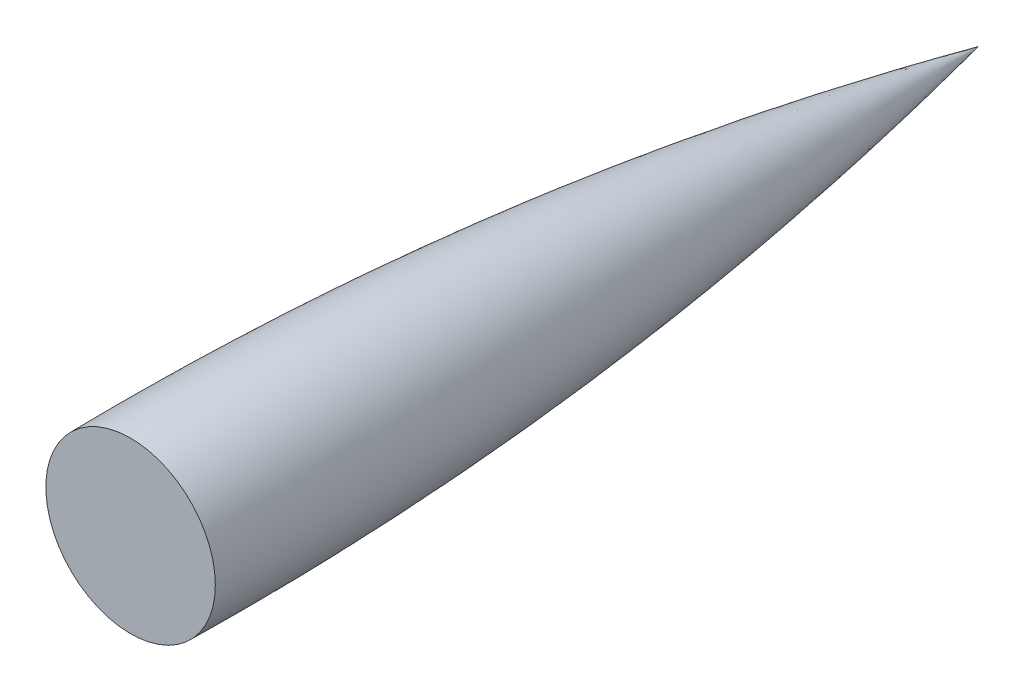
ISO-10303-21;
HEADER;
FILE_DESCRIPTION(('STEP AP214'),'2;1');
FILE_NAME('part.step','',(''),(''),'','','');
FILE_SCHEMA(('AUTOMOTIVE_DESIGN { 1 0 10303 214 1 1 1 1 }'));
ENDSEC;
DATA;
#1=APPLICATION_CONTEXT('core data for automotive mechanical design processes');
#2=APPLICATION_PROTOCOL_DEFINITION('international standard','automotive_design',2000,#1);
#3=PRODUCT_CONTEXT('',#1,'mechanical');
#4=PRODUCT('Part','Part','',(#3));
#5=PRODUCT_RELATED_PRODUCT_CATEGORY('part','',(#4));
#6=PRODUCT_DEFINITION_FORMATION('','',#4);
#7=PRODUCT_DEFINITION_CONTEXT('part definition',#1,'design');
#8=PRODUCT_DEFINITION('design','',#6,#7);
#9=PRODUCT_DEFINITION_SHAPE('','',#8);
#10=(LENGTH_UNIT() NAMED_UNIT(*) SI_UNIT(.MILLI.,.METRE.));
#11=(NAMED_UNIT(*) PLANE_ANGLE_UNIT() SI_UNIT($,.RADIAN.));
#12=(NAMED_UNIT(*) SI_UNIT($,.STERADIAN.) SOLID_ANGLE_UNIT());
#13=UNCERTAINTY_MEASURE_WITH_UNIT(LENGTH_MEASURE(1.E-05),#10,'distance_accuracy_value','');
#14=(GEOMETRIC_REPRESENTATION_CONTEXT(3) GLOBAL_UNCERTAINTY_ASSIGNED_CONTEXT((#13)) GLOBAL_UNIT_ASSIGNED_CONTEXT((#10,
#11,#12)) REPRESENTATION_CONTEXT('',''));
#15=CARTESIAN_POINT('',(0.,0.,0.));
#16=DIRECTION('',(0.,0.,1.));
#17=DIRECTION('',(1.,0.,0.));
#18=AXIS2_PLACEMENT_3D('',#15,#16,#17);
#19=CARTESIAN_POINT('',(-2220.90389982806,0.,-29.369610017194));
#20=DIRECTION('',(0.,-1.,0.));
#21=DIRECTION('',(1.,0.,0.));
#22=AXIS2_PLACEMENT_3D('',#19,#20,#21);
#23=CIRCLE('',#22,2271.89374366113);
#24=TRIMMED_CURVE('',#23,(PARAMETER_VALUE(-0.212265034629429)),
(PARAMETER_VALUE(0.212265034629429)),.T.,.PARAMETER.);
#25=CARTESIAN_POINT('',(0.,0.,-29.369610017194));
#26=DIRECTION('',(0.,0.,1.));
#27=AXIS1_PLACEMENT('',#25,#26);
#28=SURFACE_OF_REVOLUTION('',#24,#27);
#29=CARTESIAN_POINT('',(0.,0.,-508.));
#30=VERTEX_POINT('',#29);
#31=VERTEX_LOOP('',#30);
#32=FACE_BOUND('',#31,.T.);
#33=CARTESIAN_POINT('',(0.,0.,0.));
#34=DIRECTION('',(0.,0.,1.));
#35=DIRECTION('',(1.,0.,0.));
#36=AXIS2_PLACEMENT_3D('',#33,#34,#35);
#37=CIRCLE('',#36,50.8);
#38=CARTESIAN_POINT('',(50.8,0.,0.));
#39=VERTEX_POINT('',#38);
#40=EDGE_CURVE('E11',#39,#39,#37,.T.);
#41=ORIENTED_EDGE('',*,*,#40,.F.);
#42=EDGE_LOOP('',(#41));
#43=FACE_BOUND('',#42,.T.);
#44=ADVANCED_FACE('F37',(#32,#43),#28,.T.);
#45=CARTESIAN_POINT('',(0.,0.,0.));
#46=DIRECTION('',(0.,0.,1.));
#47=DIRECTION('',(1.,0.,0.));
#48=AXIS2_PLACEMENT_3D('',#45,#46,#47);
#49=PLANE('',#48);
#50=ORIENTED_EDGE('',*,*,#40,.T.);
#51=EDGE_LOOP('',(#50));
#52=FACE_BOUND('',#51,.T.);
#53=ADVANCED_FACE('F46',(#52),#49,.T.);
#54=CLOSED_SHELL('',(#44,#53));
#55=MANIFOLD_SOLID_BREP('B2',#54);
#56=ADVANCED_BREP_SHAPE_REPRESENTATION('',(#18,#55),#14);
#57=SHAPE_DEFINITION_REPRESENTATION(#9,#56);
ENDSEC;
END-ISO-10303-21;
